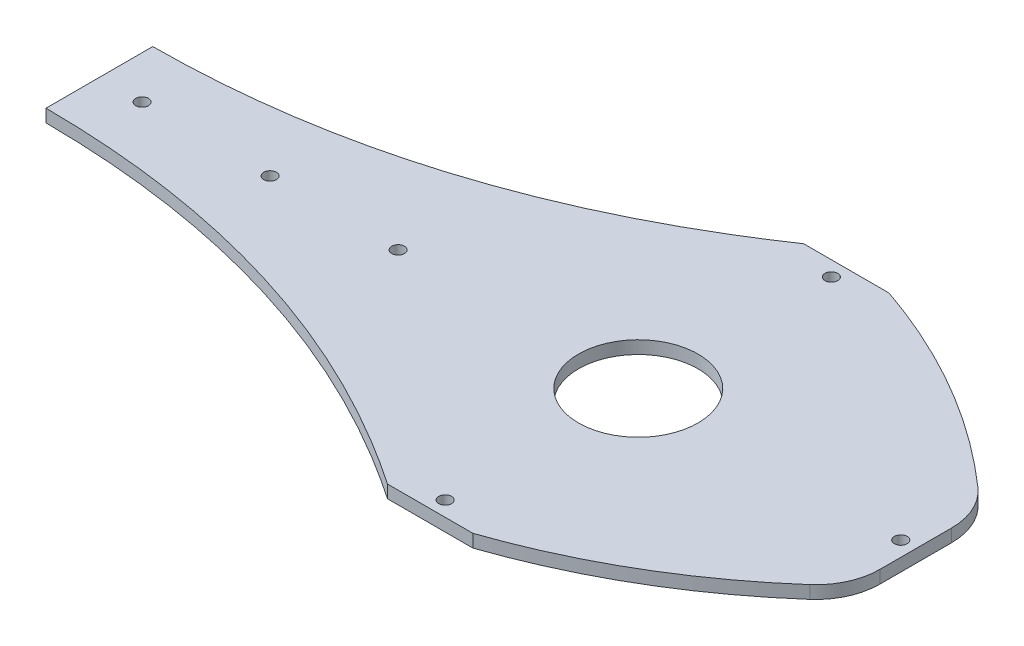
ISO-10303-21;
HEADER;
FILE_DESCRIPTION(('STEP AP214'),'2;1');
FILE_NAME('part.step','',(''),(''),'','','');
FILE_SCHEMA(('AUTOMOTIVE_DESIGN { 1 0 10303 214 1 1 1 1 }'));
ENDSEC;
DATA;
#1=APPLICATION_CONTEXT('core data for automotive mechanical design processes');
#2=APPLICATION_PROTOCOL_DEFINITION('international standard','automotive_design',2000,#1);
#3=PRODUCT_CONTEXT('',#1,'mechanical');
#4=PRODUCT('Part','Part','',(#3));
#5=PRODUCT_RELATED_PRODUCT_CATEGORY('part','',(#4));
#6=PRODUCT_DEFINITION_FORMATION('','',#4);
#7=PRODUCT_DEFINITION_CONTEXT('part definition',#1,'design');
#8=PRODUCT_DEFINITION('design','',#6,#7);
#9=PRODUCT_DEFINITION_SHAPE('','',#8);
#10=(LENGTH_UNIT() NAMED_UNIT(*) SI_UNIT(.MILLI.,.METRE.));
#11=(NAMED_UNIT(*) PLANE_ANGLE_UNIT() SI_UNIT($,.RADIAN.));
#12=(NAMED_UNIT(*) SI_UNIT($,.STERADIAN.) SOLID_ANGLE_UNIT());
#13=UNCERTAINTY_MEASURE_WITH_UNIT(LENGTH_MEASURE(1.E-05),#10,'distance_accuracy_value','');
#14=(GEOMETRIC_REPRESENTATION_CONTEXT(3) GLOBAL_UNCERTAINTY_ASSIGNED_CONTEXT((#13)) GLOBAL_UNIT_ASSIGNED_CONTEXT((#10,
#11,#12)) REPRESENTATION_CONTEXT('',''));
#15=CARTESIAN_POINT('',(0.,0.,0.));
#16=DIRECTION('',(0.,0.,1.));
#17=DIRECTION('',(1.,0.,0.));
#18=AXIS2_PLACEMENT_3D('',#15,#16,#17);
#19=CARTESIAN_POINT('',(50.,1.5,8.4128106180112));
#20=DIRECTION('',(0.,-1.,0.));
#21=DIRECTION('',(0.,0.,-1.));
#22=AXIS2_PLACEMENT_3D('',#19,#20,#21);
#23=CYLINDRICAL_SURFACE('',#22,15.);
#24=DIRECTION('',(0.,1.,0.));
#25=VECTOR('',#24,1.);
#26=CARTESIAN_POINT('',(65.,1.5,8.4128106180112));
#27=LINE('',#26,#25);
#28=CARTESIAN_POINT('',(65.,1.5,8.4128106180112));
#29=VERTEX_POINT('',#28);
#30=CARTESIAN_POINT('',(65.,-1.5,8.4128106180112));
#31=VERTEX_POINT('',#30);
#32=EDGE_CURVE('E296',#29,#31,#27,.F.);
#33=ORIENTED_EDGE('',*,*,#32,.F.);
#34=CARTESIAN_POINT('',(50.,1.5,8.4128106180112));
#35=DIRECTION('',(0.,1.,0.));
#36=DIRECTION('',(0.,0.,1.));
#37=AXIS2_PLACEMENT_3D('',#34,#35,#36);
#38=CIRCLE('',#37,15.);
#39=CARTESIAN_POINT('',(59.9034771325552,1.5,19.6787389279622));
#40=VERTEX_POINT('',#39);
#41=EDGE_CURVE('E41',#40,#29,#38,.T.);
#42=ORIENTED_EDGE('',*,*,#41,.F.);
#43=DIRECTION('',(0.,-1.,0.));
#44=VECTOR('',#43,1.);
#45=CARTESIAN_POINT('',(59.9034771325552,-1.5,19.6787389279622));
#46=LINE('',#45,#44);
#47=CARTESIAN_POINT('',(59.9034771325571,-1.5,19.6787389279606));
#48=VERTEX_POINT('',#47);
#49=EDGE_CURVE('E299',#48,#40,#46,.F.);
#50=ORIENTED_EDGE('',*,*,#49,.F.);
#51=CARTESIAN_POINT('',(50.,-1.5,8.4128106180112));
#52=DIRECTION('',(0.,1.,0.));
#53=DIRECTION('',(0.,0.,1.));
#54=AXIS2_PLACEMENT_3D('',#51,#52,#53);
#55=CIRCLE('',#54,15.);
#56=EDGE_CURVE('E11',#31,#48,#55,.F.);
#57=ORIENTED_EDGE('',*,*,#56,.F.);
#58=EDGE_LOOP('',(#33,#42,#50,#57));
#59=FACE_BOUND('',#58,.T.);
#60=ADVANCED_FACE('F34',(#59),#23,.T.);
#61=CARTESIAN_POINT('',(50.,-1.5,-8.4128106180112));
#62=DIRECTION('',(0.,-1.,0.));
#63=DIRECTION('',(0.,0.,-1.));
#64=AXIS2_PLACEMENT_3D('',#61,#62,#63);
#65=CYLINDRICAL_SURFACE('',#64,15.);
#66=DIRECTION('',(0.,-1.,0.));
#67=VECTOR('',#66,1.);
#68=CARTESIAN_POINT('',(65.,1.5,-8.4128106180112));
#69=LINE('',#68,#67);
#70=CARTESIAN_POINT('',(65.,-1.5,-8.4128106180112));
#71=VERTEX_POINT('',#70);
#72=CARTESIAN_POINT('',(65.,1.5,-8.4128106180112));
#73=VERTEX_POINT('',#72);
#74=EDGE_CURVE('E285',#71,#73,#69,.F.);
#75=ORIENTED_EDGE('',*,*,#74,.F.);
#76=CARTESIAN_POINT('',(50.,-1.5,-8.4128106180112));
#77=DIRECTION('',(0.,1.,0.));
#78=DIRECTION('',(0.,0.,1.));
#79=AXIS2_PLACEMENT_3D('',#76,#77,#78);
#80=CIRCLE('',#79,15.);
#81=CARTESIAN_POINT('',(59.9034771325552,-1.5,-19.6787389279622));
#82=VERTEX_POINT('',#81);
#83=EDGE_CURVE('E291',#82,#71,#80,.F.);
#84=ORIENTED_EDGE('',*,*,#83,.F.);
#85=DIRECTION('',(0.,-1.,0.));
#86=VECTOR('',#85,1.);
#87=CARTESIAN_POINT('',(59.9034771325552,1.5,-19.6787389279622));
#88=LINE('',#87,#86);
#89=CARTESIAN_POINT('',(59.9034771325571,1.5,-19.6787389279606));
#90=VERTEX_POINT('',#89);
#91=EDGE_CURVE('E288',#90,#82,#88,.T.);
#92=ORIENTED_EDGE('',*,*,#91,.F.);
#93=CARTESIAN_POINT('',(50.,1.5,-8.4128106180112));
#94=DIRECTION('',(0.,1.,0.));
#95=DIRECTION('',(0.,0.,1.));
#96=AXIS2_PLACEMENT_3D('',#93,#94,#95);
#97=CIRCLE('',#96,15.);
#98=EDGE_CURVE('E294',#73,#90,#97,.T.);
#99=ORIENTED_EDGE('',*,*,#98,.F.);
#100=EDGE_LOOP('',(#75,#84,#92,#99));
#101=FACE_BOUND('',#100,.T.);
#102=ADVANCED_FACE('F264',(#101),#65,.T.);
#103=CARTESIAN_POINT('',(65.,1.5,-15.));
#104=CARTESIAN_POINT('',(40.7961357215202,1.5,-38.1894459944229));
#105=CARTESIAN_POINT('',(9.99999999999999,1.5,-48.75));
#106=B_SPLINE_CURVE_WITH_KNOTS('',2,(#103,#104,#105),.UNSPECIFIED.,.F.,.F.,(3,3),(0.,1.),.UNSPECIFIED.);
#107=DIRECTION('',(0.,-1.,0.));
#108=VECTOR('',#107,1.);
#109=SURFACE_OF_LINEAR_EXTRUSION('',#106,#108);
#110=CARTESIAN_POINT('',(10.,1.5,-48.75));
#111=VERTEX_POINT('',#110);
#112=EDGE_CURVE('E266',#90,#111,#106,.T.);
#113=ORIENTED_EDGE('',*,*,#112,.F.);
#114=ORIENTED_EDGE('',*,*,#91,.T.);
#115=CARTESIAN_POINT('',(65.,-1.5,-15.));
#116=CARTESIAN_POINT('',(40.7961357215202,-1.5,-38.1894459944229));
#117=CARTESIAN_POINT('',(9.99999999999999,-1.5,-48.75));
#118=B_SPLINE_CURVE_WITH_KNOTS('',2,(#115,#116,#117),.UNSPECIFIED.,.F.,.F.,(3,3),(0.,1.),.UNSPECIFIED.);
#119=CARTESIAN_POINT('',(10.,-1.5,-48.75));
#120=VERTEX_POINT('',#119);
#121=EDGE_CURVE('E308',#82,#120,#118,.T.);
#122=ORIENTED_EDGE('',*,*,#121,.T.);
#123=DIRECTION('',(0.,-1.,0.));
#124=VECTOR('',#123,1.);
#125=CARTESIAN_POINT('',(10.,1.5,-48.75));
#126=LINE('',#125,#124);
#127=EDGE_CURVE('E282',#111,#120,#126,.T.);
#128=ORIENTED_EDGE('',*,*,#127,.F.);
#129=EDGE_LOOP('',(#113,#114,#122,#128));
#130=FACE_BOUND('',#129,.T.);
#131=ADVANCED_FACE('F260',(#130),#109,.F.);
#132=CARTESIAN_POINT('',(0.,1.5,-48.75));
#133=DIRECTION('',(0.,0.,-1.));
#134=DIRECTION('',(-1.,0.,0.));
#135=AXIS2_PLACEMENT_3D('',#132,#133,#134);
#136=PLANE('',#135);
#137=ORIENTED_EDGE('',*,*,#127,.T.);
#138=DIRECTION('',(1.,0.,0.));
#139=VECTOR('',#138,1.);
#140=CARTESIAN_POINT('',(0.,-1.5,-48.75));
#141=LINE('',#140,#139);
#142=CARTESIAN_POINT('',(-10.,-1.5,-48.75));
#143=VERTEX_POINT('',#142);
#144=EDGE_CURVE('E312',#143,#120,#141,.T.);
#145=ORIENTED_EDGE('',*,*,#144,.F.);
#146=DIRECTION('',(0.,1.,0.));
#147=VECTOR('',#146,1.);
#148=CARTESIAN_POINT('',(-10.,-1.5,-48.75));
#149=LINE('',#148,#147);
#150=CARTESIAN_POINT('',(-10.,1.5,-48.75));
#151=VERTEX_POINT('',#150);
#152=EDGE_CURVE('E207',#143,#151,#149,.T.);
#153=ORIENTED_EDGE('',*,*,#152,.T.);
#154=DIRECTION('',(1.,0.,0.));
#155=VECTOR('',#154,1.);
#156=CARTESIAN_POINT('',(0.,1.5,-48.75));
#157=LINE('',#156,#155);
#158=EDGE_CURVE('E272',#151,#111,#157,.T.);
#159=ORIENTED_EDGE('',*,*,#158,.T.);
#160=EDGE_LOOP('',(#137,#145,#153,#159));
#161=FACE_BOUND('',#160,.T.);
#162=ADVANCED_FACE('F256',(#161),#136,.T.);
#163=CARTESIAN_POINT('',(65.,1.5,0.));
#164=DIRECTION('',(-1.,0.,0.));
#165=DIRECTION('',(0.,0.,1.));
#166=AXIS2_PLACEMENT_3D('',#163,#164,#165);
#167=PLANE('',#166);
#168=DIRECTION('',(0.,0.,-1.));
#169=VECTOR('',#168,1.);
#170=CARTESIAN_POINT('',(65.,1.5,0.));
#171=LINE('',#170,#169);
#172=EDGE_CURVE('E280',#29,#73,#171,.T.);
#173=ORIENTED_EDGE('',*,*,#172,.F.);
#174=ORIENTED_EDGE('',*,*,#32,.T.);
#175=DIRECTION('',(0.,0.,-1.));
#176=VECTOR('',#175,1.);
#177=CARTESIAN_POINT('',(65.,-1.5,0.));
#178=LINE('',#177,#176);
#179=EDGE_CURVE('E273',#31,#71,#178,.T.);
#180=ORIENTED_EDGE('',*,*,#179,.T.);
#181=ORIENTED_EDGE('',*,*,#74,.T.);
#182=EDGE_LOOP('',(#173,#174,#180,#181));
#183=FACE_BOUND('',#182,.T.);
#184=ADVANCED_FACE('F252',(#183),#167,.F.);
#185=CARTESIAN_POINT('',(0.,1.5,0.));
#186=DIRECTION('',(0.,1.,0.));
#187=DIRECTION('',(0.,0.,1.));
#188=AXIS2_PLACEMENT_3D('',#185,#186,#187);
#189=PLANE('',#188);
#190=CARTESIAN_POINT('',(0.,1.5,0.));
#191=DIRECTION('',(0.,1.,0.));
#192=DIRECTION('',(0.,0.,1.));
#193=AXIS2_PLACEMENT_3D('',#190,#191,#192);
#194=CIRCLE('',#193,14.);
#195=CARTESIAN_POINT('',(0.,1.5,14.));
#196=VERTEX_POINT('',#195);
#197=EDGE_CURVE('E140',#196,#196,#194,.T.);
#198=ORIENTED_EDGE('',*,*,#197,.F.);
#199=EDGE_LOOP('',(#198));
#200=FACE_BOUND('',#199,.T.);
#201=CARTESIAN_POINT('',(0.,1.5,45.25));
#202=DIRECTION('',(0.,-1.,0.));
#203=DIRECTION('',(0.,0.,-1.));
#204=AXIS2_PLACEMENT_3D('',#201,#202,#203);
#205=CIRCLE('',#204,1.5);
#206=CARTESIAN_POINT('',(0.,1.5,43.75));
#207=VERTEX_POINT('',#206);
#208=EDGE_CURVE('E210',#207,#207,#205,.T.);
#209=ORIENTED_EDGE('',*,*,#208,.T.);
#210=EDGE_LOOP('',(#209));
#211=FACE_BOUND('',#210,.T.);
#212=CARTESIAN_POINT('',(-56.25,1.5,0.));
#213=DIRECTION('',(0.,1.,0.));
#214=DIRECTION('',(0.,0.,1.));
#215=AXIS2_PLACEMENT_3D('',#212,#213,#214);
#216=CIRCLE('',#215,1.5);
#217=CARTESIAN_POINT('',(-56.25,1.5,1.50000000000001));
#218=VERTEX_POINT('',#217);
#219=EDGE_CURVE('E191',#218,#218,#216,.T.);
#220=ORIENTED_EDGE('',*,*,#219,.F.);
#221=EDGE_LOOP('',(#220));
#222=FACE_BOUND('',#221,.T.);
#223=CARTESIAN_POINT('',(-86.25,1.5,0.));
#224=DIRECTION('',(0.,1.,0.));
#225=DIRECTION('',(0.,0.,1.));
#226=AXIS2_PLACEMENT_3D('',#223,#224,#225);
#227=CIRCLE('',#226,1.5);
#228=CARTESIAN_POINT('',(-86.25,1.5,1.5));
#229=VERTEX_POINT('',#228);
#230=EDGE_CURVE('E326',#229,#229,#227,.T.);
#231=ORIENTED_EDGE('',*,*,#230,.F.);
#232=EDGE_LOOP('',(#231));
#233=FACE_BOUND('',#232,.T.);
#234=CARTESIAN_POINT('',(-116.25,1.5,0.));
#235=DIRECTION('',(0.,1.,0.));
#236=DIRECTION('',(0.,0.,1.));
#237=AXIS2_PLACEMENT_3D('',#234,#235,#236);
#238=CIRCLE('',#237,1.5);
#239=CARTESIAN_POINT('',(-116.25,1.5,1.5));
#240=VERTEX_POINT('',#239);
#241=EDGE_CURVE('E317',#240,#240,#238,.T.);
#242=ORIENTED_EDGE('',*,*,#241,.F.);
#243=EDGE_LOOP('',(#242));
#244=FACE_BOUND('',#243,.T.);
#245=ORIENTED_EDGE('',*,*,#158,.F.);
#246=CARTESIAN_POINT('',(-126.25,1.5,-12.5));
#247=CARTESIAN_POINT('',(-62.8537048693348,1.5,-12.7779173309378));
#248=CARTESIAN_POINT('',(-10.,1.5,-48.75));
#249=B_SPLINE_CURVE_WITH_KNOTS('',2,(#246,#247,#248),.UNSPECIFIED.,.F.,.F.,(3,3),(0.,1.),.UNSPECIFIED.);
#250=CARTESIAN_POINT('',(-126.25,1.5,-12.5));
#251=VERTEX_POINT('',#250);
#252=EDGE_CURVE('E314',#251,#151,#249,.T.);
#253=ORIENTED_EDGE('',*,*,#252,.F.);
#254=DIRECTION('',(0.,0.,-1.));
#255=VECTOR('',#254,1.);
#256=CARTESIAN_POINT('',(-126.25,1.5,0.));
#257=LINE('',#256,#255);
#258=CARTESIAN_POINT('',(-126.25,1.5,12.5));
#259=VERTEX_POINT('',#258);
#260=EDGE_CURVE('E134',#259,#251,#257,.T.);
#261=ORIENTED_EDGE('',*,*,#260,.F.);
#262=CARTESIAN_POINT('',(-126.25,1.5,12.5));
#263=CARTESIAN_POINT('',(-62.8537048693348,1.5,12.7779173309378));
#264=CARTESIAN_POINT('',(-10.,1.5,48.75));
#265=B_SPLINE_CURVE_WITH_KNOTS('',2,(#262,#263,#264),.UNSPECIFIED.,.F.,.F.,(3,3),(0.,1.),.UNSPECIFIED.);
#266=CARTESIAN_POINT('',(-10.,1.5,48.75));
#267=VERTEX_POINT('',#266);
#268=EDGE_CURVE('E125',#259,#267,#265,.T.);
#269=ORIENTED_EDGE('',*,*,#268,.T.);
#270=DIRECTION('',(1.,0.,0.));
#271=VECTOR('',#270,1.);
#272=CARTESIAN_POINT('',(0.,1.5,48.75));
#273=LINE('',#272,#271);
#274=CARTESIAN_POINT('',(10.,1.5,48.75));
#275=VERTEX_POINT('',#274);
#276=EDGE_CURVE('E108',#267,#275,#273,.T.);
#277=ORIENTED_EDGE('',*,*,#276,.T.);
#278=CARTESIAN_POINT('',(65.,1.5,15.));
#279=CARTESIAN_POINT('',(40.7961357215202,1.5,38.1894459944229));
#280=CARTESIAN_POINT('',(9.99999999999999,1.5,48.75));
#281=B_SPLINE_CURVE_WITH_KNOTS('',2,(#278,#279,#280),.UNSPECIFIED.,.F.,.F.,(3,3),(0.,1.),.UNSPECIFIED.);
#282=EDGE_CURVE('E119',#40,#275,#281,.T.);
#283=ORIENTED_EDGE('',*,*,#282,.F.);
#284=ORIENTED_EDGE('',*,*,#41,.T.);
#285=ORIENTED_EDGE('',*,*,#172,.T.);
#286=ORIENTED_EDGE('',*,*,#98,.T.);
#287=ORIENTED_EDGE('',*,*,#112,.T.);
#288=EDGE_LOOP('',(#245,#253,#261,#269,#277,#283,#284,#285,#286,#287));
#289=FACE_BOUND('',#288,.T.);
#290=CARTESIAN_POINT('',(0.,1.5,-45.25));
#291=DIRECTION('',(0.,1.,0.));
#292=DIRECTION('',(0.,0.,1.));
#293=AXIS2_PLACEMENT_3D('',#290,#291,#292);
#294=CIRCLE('',#293,1.5);
#295=CARTESIAN_POINT('',(0.,1.5,-43.75));
#296=VERTEX_POINT('',#295);
#297=EDGE_CURVE('E351',#296,#296,#294,.T.);
#298=ORIENTED_EDGE('',*,*,#297,.F.);
#299=EDGE_LOOP('',(#298));
#300=FACE_BOUND('',#299,.T.);
#301=CARTESIAN_POINT('',(61.5,1.5,0.));
#302=DIRECTION('',(0.,1.,0.));
#303=DIRECTION('',(0.,0.,1.));
#304=AXIS2_PLACEMENT_3D('',#301,#302,#303);
#305=CIRCLE('',#304,1.5);
#306=CARTESIAN_POINT('',(61.5,1.5,1.5));
#307=VERTEX_POINT('',#306);
#308=EDGE_CURVE('E348',#307,#307,#305,.T.);
#309=ORIENTED_EDGE('',*,*,#308,.F.);
#310=EDGE_LOOP('',(#309));
#311=FACE_BOUND('',#310,.T.);
#312=ADVANCED_FACE('F130',(#200,#211,#222,#233,#244,#289,#300,#311),#189,.T.);
#313=CARTESIAN_POINT('',(0.,-1.5,0.));
#314=DIRECTION('',(0.,1.,0.));
#315=DIRECTION('',(0.,0.,1.));
#316=AXIS2_PLACEMENT_3D('',#313,#314,#315);
#317=PLANE('',#316);
#318=CARTESIAN_POINT('',(0.,-1.5,0.));
#319=DIRECTION('',(0.,1.,0.));
#320=DIRECTION('',(0.,0.,1.));
#321=AXIS2_PLACEMENT_3D('',#318,#319,#320);
#322=CIRCLE('',#321,14.);
#323=CARTESIAN_POINT('',(0.,-1.5,14.));
#324=VERTEX_POINT('',#323);
#325=EDGE_CURVE('E136',#324,#324,#322,.T.);
#326=ORIENTED_EDGE('',*,*,#325,.T.);
#327=EDGE_LOOP('',(#326));
#328=FACE_BOUND('',#327,.T.);
#329=CARTESIAN_POINT('',(0.,-1.5,45.25));
#330=DIRECTION('',(0.,-1.,0.));
#331=DIRECTION('',(0.,0.,-1.));
#332=AXIS2_PLACEMENT_3D('',#329,#330,#331);
#333=CIRCLE('',#332,1.5);
#334=CARTESIAN_POINT('',(0.,-1.5,43.75));
#335=VERTEX_POINT('',#334);
#336=EDGE_CURVE('E212',#335,#335,#333,.T.);
#337=ORIENTED_EDGE('',*,*,#336,.F.);
#338=EDGE_LOOP('',(#337));
#339=FACE_BOUND('',#338,.T.);
#340=CARTESIAN_POINT('',(-56.25,-1.5,0.));
#341=DIRECTION('',(0.,1.,0.));
#342=DIRECTION('',(0.,0.,1.));
#343=AXIS2_PLACEMENT_3D('',#340,#341,#342);
#344=CIRCLE('',#343,1.5);
#345=CARTESIAN_POINT('',(-56.25,-1.5,1.50000000000001));
#346=VERTEX_POINT('',#345);
#347=EDGE_CURVE('E203',#346,#346,#344,.T.);
#348=ORIENTED_EDGE('',*,*,#347,.T.);
#349=EDGE_LOOP('',(#348));
#350=FACE_BOUND('',#349,.T.);
#351=CARTESIAN_POINT('',(-86.25,-1.5,0.));
#352=DIRECTION('',(0.,1.,0.));
#353=DIRECTION('',(0.,0.,1.));
#354=AXIS2_PLACEMENT_3D('',#351,#352,#353);
#355=CIRCLE('',#354,1.5);
#356=CARTESIAN_POINT('',(-86.25,-1.5,1.5));
#357=VERTEX_POINT('',#356);
#358=EDGE_CURVE('E200',#357,#357,#355,.T.);
#359=ORIENTED_EDGE('',*,*,#358,.T.);
#360=EDGE_LOOP('',(#359));
#361=FACE_BOUND('',#360,.T.);
#362=CARTESIAN_POINT('',(-116.25,-1.5,0.));
#363=DIRECTION('',(0.,1.,0.));
#364=DIRECTION('',(0.,0.,1.));
#365=AXIS2_PLACEMENT_3D('',#362,#363,#364);
#366=CIRCLE('',#365,1.5);
#367=CARTESIAN_POINT('',(-116.25,-1.5,1.5));
#368=VERTEX_POINT('',#367);
#369=EDGE_CURVE('E197',#368,#368,#366,.T.);
#370=ORIENTED_EDGE('',*,*,#369,.T.);
#371=EDGE_LOOP('',(#370));
#372=FACE_BOUND('',#371,.T.);
#373=CARTESIAN_POINT('',(-126.25,-1.5,-12.5));
#374=CARTESIAN_POINT('',(-62.8537048693348,-1.5,-12.7779173309378));
#375=CARTESIAN_POINT('',(-10.,-1.5,-48.75));
#376=B_SPLINE_CURVE_WITH_KNOTS('',2,(#373,#374,#375),.UNSPECIFIED.,.F.,.F.,(3,3),(0.,1.),.UNSPECIFIED.);
#377=CARTESIAN_POINT('',(-126.25,-1.5,-12.5));
#378=VERTEX_POINT('',#377);
#379=EDGE_CURVE('E183',#378,#143,#376,.T.);
#380=ORIENTED_EDGE('',*,*,#379,.T.);
#381=ORIENTED_EDGE('',*,*,#144,.T.);
#382=ORIENTED_EDGE('',*,*,#121,.F.);
#383=ORIENTED_EDGE('',*,*,#83,.T.);
#384=ORIENTED_EDGE('',*,*,#179,.F.);
#385=ORIENTED_EDGE('',*,*,#56,.T.);
#386=CARTESIAN_POINT('',(65.,-1.5,15.));
#387=CARTESIAN_POINT('',(40.7961357215202,-1.5,38.1894459944229));
#388=CARTESIAN_POINT('',(9.99999999999999,-1.5,48.75));
#389=B_SPLINE_CURVE_WITH_KNOTS('',2,(#386,#387,#388),.UNSPECIFIED.,.F.,.F.,(3,3),(0.,1.),.UNSPECIFIED.);
#390=CARTESIAN_POINT('',(10.,-1.5,48.75));
#391=VERTEX_POINT('',#390);
#392=EDGE_CURVE('E215',#48,#391,#389,.T.);
#393=ORIENTED_EDGE('',*,*,#392,.T.);
#394=DIRECTION('',(1.,0.,0.));
#395=VECTOR('',#394,1.);
#396=CARTESIAN_POINT('',(0.,-1.5,48.75));
#397=LINE('',#396,#395);
#398=CARTESIAN_POINT('',(-10.,-1.5,48.75));
#399=VERTEX_POINT('',#398);
#400=EDGE_CURVE('E221',#399,#391,#397,.T.);
#401=ORIENTED_EDGE('',*,*,#400,.F.);
#402=CARTESIAN_POINT('',(-126.25,-1.5,12.5));
#403=CARTESIAN_POINT('',(-62.8537048693348,-1.5,12.7779173309378));
#404=CARTESIAN_POINT('',(-10.,-1.5,48.75));
#405=B_SPLINE_CURVE_WITH_KNOTS('',2,(#402,#403,#404),.UNSPECIFIED.,.F.,.F.,(3,3),(0.,1.),.UNSPECIFIED.);
#406=CARTESIAN_POINT('',(-126.25,-1.5,12.5));
#407=VERTEX_POINT('',#406);
#408=EDGE_CURVE('E127',#407,#399,#405,.T.);
#409=ORIENTED_EDGE('',*,*,#408,.F.);
#410=DIRECTION('',(0.,0.,-1.));
#411=VECTOR('',#410,1.);
#412=CARTESIAN_POINT('',(-126.25,-1.5,0.));
#413=LINE('',#412,#411);
#414=EDGE_CURVE('E190',#407,#378,#413,.T.);
#415=ORIENTED_EDGE('',*,*,#414,.T.);
#416=EDGE_LOOP('',(#380,#381,#382,#383,#384,#385,#393,#401,#409,#415));
#417=FACE_BOUND('',#416,.T.);
#418=CARTESIAN_POINT('',(0.,-1.5,-45.25));
#419=DIRECTION('',(0.,1.,0.));
#420=DIRECTION('',(0.,0.,1.));
#421=AXIS2_PLACEMENT_3D('',#418,#419,#420);
#422=CIRCLE('',#421,1.5);
#423=CARTESIAN_POINT('',(0.,-1.5,-43.75));
#424=VERTEX_POINT('',#423);
#425=EDGE_CURVE('E343',#424,#424,#422,.T.);
#426=ORIENTED_EDGE('',*,*,#425,.T.);
#427=EDGE_LOOP('',(#426));
#428=FACE_BOUND('',#427,.T.);
#429=CARTESIAN_POINT('',(61.5,-1.5,0.));
#430=DIRECTION('',(0.,1.,0.));
#431=DIRECTION('',(0.,0.,1.));
#432=AXIS2_PLACEMENT_3D('',#429,#430,#431);
#433=CIRCLE('',#432,1.5);
#434=CARTESIAN_POINT('',(61.5,-1.5,1.5));
#435=VERTEX_POINT('',#434);
#436=EDGE_CURVE('E346',#435,#435,#433,.T.);
#437=ORIENTED_EDGE('',*,*,#436,.T.);
#438=EDGE_LOOP('',(#437));
#439=FACE_BOUND('',#438,.T.);
#440=ADVANCED_FACE('F245',(#328,#339,#350,#361,#372,#417,#428,#439),#317,.F.);
#441=CARTESIAN_POINT('',(61.5,-1.5,0.));
#442=DIRECTION('',(0.,1.,0.));
#443=DIRECTION('',(0.,0.,1.));
#444=AXIS2_PLACEMENT_3D('',#441,#442,#443);
#445=CYLINDRICAL_SURFACE('',#444,1.5);
#446=ORIENTED_EDGE('',*,*,#308,.T.);
#447=EDGE_LOOP('',(#446));
#448=FACE_BOUND('',#447,.T.);
#449=ORIENTED_EDGE('',*,*,#436,.F.);
#450=EDGE_LOOP('',(#449));
#451=FACE_BOUND('',#450,.T.);
#452=ADVANCED_FACE('F241',(#448,#451),#445,.F.);
#453=CARTESIAN_POINT('',(0.,-1.5,-45.25));
#454=DIRECTION('',(0.,1.,0.));
#455=DIRECTION('',(0.,0.,1.));
#456=AXIS2_PLACEMENT_3D('',#453,#454,#455);
#457=CYLINDRICAL_SURFACE('',#456,1.5);
#458=ORIENTED_EDGE('',*,*,#425,.F.);
#459=EDGE_LOOP('',(#458));
#460=FACE_BOUND('',#459,.T.);
#461=ORIENTED_EDGE('',*,*,#297,.T.);
#462=EDGE_LOOP('',(#461));
#463=FACE_BOUND('',#462,.T.);
#464=ADVANCED_FACE('F237',(#460,#463),#457,.F.);
#465=DIRECTION('',(0.,-1.,0.));
#466=VECTOR('',#465,1.);
#467=SURFACE_OF_LINEAR_EXTRUSION('',#281,#466);
#468=ORIENTED_EDGE('',*,*,#392,.F.);
#469=ORIENTED_EDGE('',*,*,#49,.T.);
#470=ORIENTED_EDGE('',*,*,#282,.T.);
#471=DIRECTION('',(0.,-1.,0.));
#472=VECTOR('',#471,1.);
#473=CARTESIAN_POINT('',(10.,1.5,48.75));
#474=LINE('',#473,#472);
#475=EDGE_CURVE('E115',#275,#391,#474,.T.);
#476=ORIENTED_EDGE('',*,*,#475,.T.);
#477=EDGE_LOOP('',(#468,#469,#470,#476));
#478=FACE_BOUND('',#477,.T.);
#479=ADVANCED_FACE('F234',(#478),#467,.T.);
#480=CARTESIAN_POINT('',(0.,1.5,48.75));
#481=DIRECTION('',(0.,0.,-1.));
#482=DIRECTION('',(-1.,0.,0.));
#483=AXIS2_PLACEMENT_3D('',#480,#481,#482);
#484=PLANE('',#483);
#485=ORIENTED_EDGE('',*,*,#276,.F.);
#486=DIRECTION('',(0.,1.,0.));
#487=VECTOR('',#486,1.);
#488=CARTESIAN_POINT('',(-10.,-1.5,48.75));
#489=LINE('',#488,#487);
#490=EDGE_CURVE('E112',#399,#267,#489,.T.);
#491=ORIENTED_EDGE('',*,*,#490,.F.);
#492=ORIENTED_EDGE('',*,*,#400,.T.);
#493=ORIENTED_EDGE('',*,*,#475,.F.);
#494=EDGE_LOOP('',(#485,#491,#492,#493));
#495=FACE_BOUND('',#494,.T.);
#496=ADVANCED_FACE('F110',(#495),#484,.F.);
#497=CARTESIAN_POINT('',(0.,-1.5,45.25));
#498=DIRECTION('',(0.,1.,0.));
#499=DIRECTION('',(0.,0.,1.));
#500=AXIS2_PLACEMENT_3D('',#497,#498,#499);
#501=CYLINDRICAL_SURFACE('',#500,1.5);
#502=ORIENTED_EDGE('',*,*,#208,.F.);
#503=EDGE_LOOP('',(#502));
#504=FACE_BOUND('',#503,.T.);
#505=ORIENTED_EDGE('',*,*,#336,.T.);
#506=EDGE_LOOP('',(#505));
#507=FACE_BOUND('',#506,.T.);
#508=ADVANCED_FACE('F180',(#504,#507),#501,.F.);
#509=DIRECTION('',(0.,1.,0.));
#510=VECTOR('',#509,1.);
#511=SURFACE_OF_LINEAR_EXTRUSION('',#376,#510);
#512=DIRECTION('',(0.,1.,0.));
#513=VECTOR('',#512,1.);
#514=CARTESIAN_POINT('',(-126.25,-1.5,-12.5));
#515=LINE('',#514,#513);
#516=EDGE_CURVE('E206',#378,#251,#515,.T.);
#517=ORIENTED_EDGE('',*,*,#516,.T.);
#518=ORIENTED_EDGE('',*,*,#252,.T.);
#519=ORIENTED_EDGE('',*,*,#152,.F.);
#520=ORIENTED_EDGE('',*,*,#379,.F.);
#521=EDGE_LOOP('',(#517,#518,#519,#520));
#522=FACE_BOUND('',#521,.T.);
#523=ADVANCED_FACE('F165',(#522),#511,.F.);
#524=CARTESIAN_POINT('',(-56.25,-1.5,0.));
#525=DIRECTION('',(0.,1.,0.));
#526=DIRECTION('',(0.,0.,1.));
#527=AXIS2_PLACEMENT_3D('',#524,#525,#526);
#528=CYLINDRICAL_SURFACE('',#527,1.5);
#529=ORIENTED_EDGE('',*,*,#219,.T.);
#530=EDGE_LOOP('',(#529));
#531=FACE_BOUND('',#530,.T.);
#532=ORIENTED_EDGE('',*,*,#347,.F.);
#533=EDGE_LOOP('',(#532));
#534=FACE_BOUND('',#533,.T.);
#535=ADVANCED_FACE('F161',(#531,#534),#528,.F.);
#536=CARTESIAN_POINT('',(-86.25,-1.5,0.));
#537=DIRECTION('',(0.,1.,0.));
#538=DIRECTION('',(0.,0.,1.));
#539=AXIS2_PLACEMENT_3D('',#536,#537,#538);
#540=CYLINDRICAL_SURFACE('',#539,1.5);
#541=ORIENTED_EDGE('',*,*,#230,.T.);
#542=EDGE_LOOP('',(#541));
#543=FACE_BOUND('',#542,.T.);
#544=ORIENTED_EDGE('',*,*,#358,.F.);
#545=EDGE_LOOP('',(#544));
#546=FACE_BOUND('',#545,.T.);
#547=ADVANCED_FACE('F164',(#543,#546),#540,.F.);
#548=CARTESIAN_POINT('',(-116.25,-1.5,0.));
#549=DIRECTION('',(0.,1.,0.));
#550=DIRECTION('',(0.,0.,1.));
#551=AXIS2_PLACEMENT_3D('',#548,#549,#550);
#552=CYLINDRICAL_SURFACE('',#551,1.5);
#553=ORIENTED_EDGE('',*,*,#241,.T.);
#554=EDGE_LOOP('',(#553));
#555=FACE_BOUND('',#554,.T.);
#556=ORIENTED_EDGE('',*,*,#369,.F.);
#557=EDGE_LOOP('',(#556));
#558=FACE_BOUND('',#557,.T.);
#559=ADVANCED_FACE('F169',(#555,#558),#552,.F.);
#560=CARTESIAN_POINT('',(-126.25,-1.5,0.));
#561=DIRECTION('',(1.,0.,0.));
#562=DIRECTION('',(0.,0.,-1.));
#563=AXIS2_PLACEMENT_3D('',#560,#561,#562);
#564=PLANE('',#563);
#565=ORIENTED_EDGE('',*,*,#414,.F.);
#566=DIRECTION('',(0.,1.,0.));
#567=VECTOR('',#566,1.);
#568=CARTESIAN_POINT('',(-126.25,-1.5,12.5));
#569=LINE('',#568,#567);
#570=EDGE_CURVE('E128',#407,#259,#569,.T.);
#571=ORIENTED_EDGE('',*,*,#570,.T.);
#572=ORIENTED_EDGE('',*,*,#260,.T.);
#573=ORIENTED_EDGE('',*,*,#516,.F.);
#574=EDGE_LOOP('',(#565,#571,#572,#573));
#575=FACE_BOUND('',#574,.T.);
#576=ADVANCED_FACE('F160',(#575),#564,.F.);
#577=DIRECTION('',(0.,1.,0.));
#578=VECTOR('',#577,1.);
#579=SURFACE_OF_LINEAR_EXTRUSION('',#405,#578);
#580=ORIENTED_EDGE('',*,*,#490,.T.);
#581=ORIENTED_EDGE('',*,*,#268,.F.);
#582=ORIENTED_EDGE('',*,*,#570,.F.);
#583=ORIENTED_EDGE('',*,*,#408,.T.);
#584=EDGE_LOOP('',(#580,#581,#582,#583));
#585=FACE_BOUND('',#584,.T.);
#586=ADVANCED_FACE('F123',(#585),#579,.T.);
#587=CARTESIAN_POINT('',(0.,-1.5,0.));
#588=DIRECTION('',(0.,1.,0.));
#589=DIRECTION('',(0.,0.,1.));
#590=AXIS2_PLACEMENT_3D('',#587,#588,#589);
#591=CYLINDRICAL_SURFACE('',#590,14.);
#592=ORIENTED_EDGE('',*,*,#325,.F.);
#593=EDGE_LOOP('',(#592));
#594=FACE_BOUND('',#593,.T.);
#595=ORIENTED_EDGE('',*,*,#197,.T.);
#596=EDGE_LOOP('',(#595));
#597=FACE_BOUND('',#596,.T.);
#598=ADVANCED_FACE('F159',(#594,#597),#591,.F.);
#599=CLOSED_SHELL('',(#60,#102,#131,#162,#184,#312,#440,#452,#464,#479,#496,#508,#523,#535,#547,
#559,#576,#586,#598));
#600=MANIFOLD_SOLID_BREP('B2',#599);
#601=ADVANCED_BREP_SHAPE_REPRESENTATION('',(#18,#600),#14);
#602=SHAPE_DEFINITION_REPRESENTATION(#9,#601);
ENDSEC;
END-ISO-10303-21;
